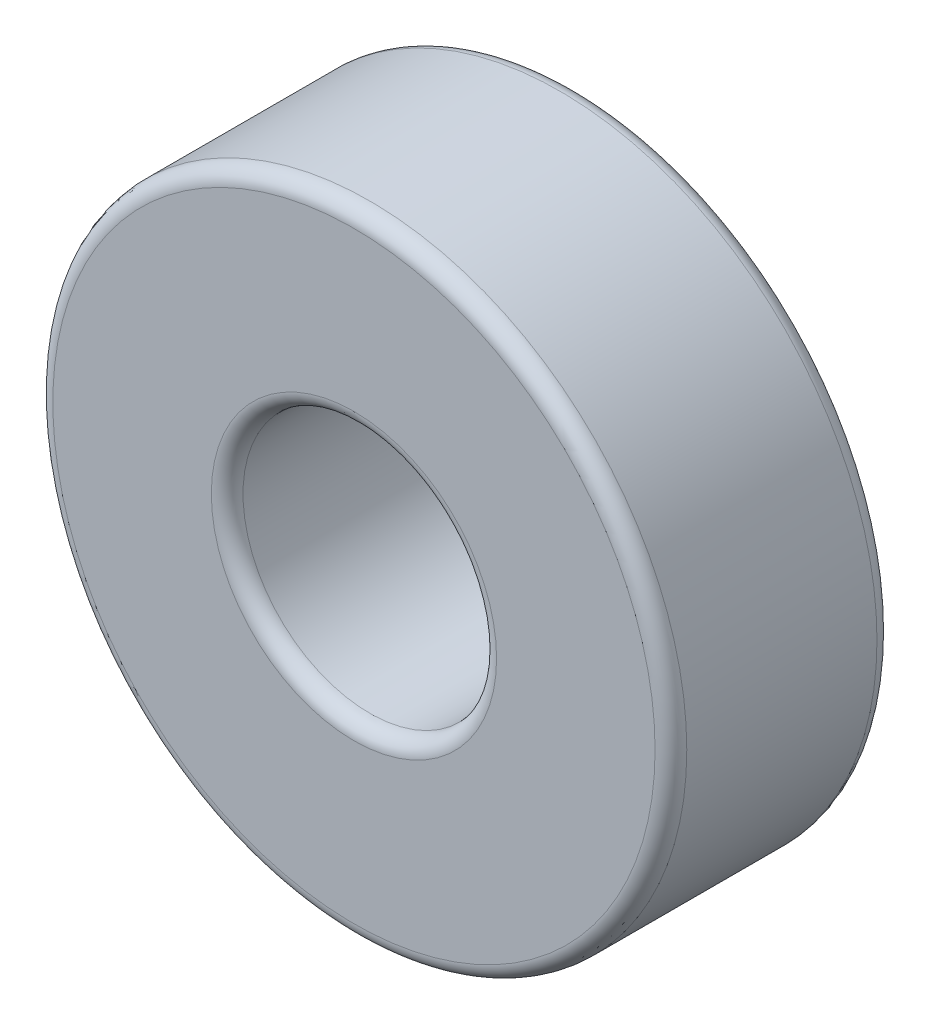
ISO-10303-21;
HEADER;
FILE_DESCRIPTION(('STEP AP214'),'2;1');
FILE_NAME('part.step','',(''),(''),'','','');
FILE_SCHEMA(('AUTOMOTIVE_DESIGN { 1 0 10303 214 1 1 1 1 }'));
ENDSEC;
DATA;
#1=APPLICATION_CONTEXT('core data for automotive mechanical design processes');
#2=APPLICATION_PROTOCOL_DEFINITION('international standard','automotive_design',2000,#1);
#3=PRODUCT_CONTEXT('',#1,'mechanical');
#4=PRODUCT('Part','Part','',(#3));
#5=PRODUCT_RELATED_PRODUCT_CATEGORY('part','',(#4));
#6=PRODUCT_DEFINITION_FORMATION('','',#4);
#7=PRODUCT_DEFINITION_CONTEXT('part definition',#1,'design');
#8=PRODUCT_DEFINITION('design','',#6,#7);
#9=PRODUCT_DEFINITION_SHAPE('','',#8);
#10=(LENGTH_UNIT() NAMED_UNIT(*) SI_UNIT(.MILLI.,.METRE.));
#11=(NAMED_UNIT(*) PLANE_ANGLE_UNIT() SI_UNIT($,.RADIAN.));
#12=(NAMED_UNIT(*) SI_UNIT($,.STERADIAN.) SOLID_ANGLE_UNIT());
#13=UNCERTAINTY_MEASURE_WITH_UNIT(LENGTH_MEASURE(1.E-05),#10,'distance_accuracy_value','');
#14=(GEOMETRIC_REPRESENTATION_CONTEXT(3) GLOBAL_UNCERTAINTY_ASSIGNED_CONTEXT((#13)) GLOBAL_UNIT_ASSIGNED_CONTEXT((#10,
#11,#12)) REPRESENTATION_CONTEXT('',''));
#15=CARTESIAN_POINT('',(0.,0.,0.));
#16=DIRECTION('',(0.,0.,1.));
#17=DIRECTION('',(1.,0.,0.));
#18=AXIS2_PLACEMENT_3D('',#15,#16,#17);
#19=CARTESIAN_POINT('',(0.,0.,7.));
#20=DIRECTION('',(0.,0.,1.));
#21=DIRECTION('',(1.,0.,0.));
#22=AXIS2_PLACEMENT_3D('',#19,#20,#21);
#23=PLANE('',#22);
#24=CARTESIAN_POINT('',(0.,0.,7.));
#25=DIRECTION('',(0.,0.,1.));
#26=DIRECTION('',(1.,0.,0.));
#27=AXIS2_PLACEMENT_3D('',#24,#25,#26);
#28=CIRCLE('',#27,4.5);
#29=CARTESIAN_POINT('',(4.5,0.,7.));
#30=VERTEX_POINT('',#29);
#31=EDGE_CURVE('E50',#30,#30,#28,.F.);
#32=ORIENTED_EDGE('',*,*,#31,.T.);
#33=EDGE_LOOP('',(#32));
#34=FACE_BOUND('',#33,.T.);
#35=CARTESIAN_POINT('',(0.,0.,7.));
#36=DIRECTION('',(0.,0.,1.));
#37=DIRECTION('',(1.,0.,0.));
#38=AXIS2_PLACEMENT_3D('',#35,#36,#37);
#39=CIRCLE('',#38,9.5);
#40=CARTESIAN_POINT('',(9.5,0.,7.));
#41=VERTEX_POINT('',#40);
#42=EDGE_CURVE('E55',#41,#41,#39,.T.);
#43=ORIENTED_EDGE('',*,*,#42,.T.);
#44=EDGE_LOOP('',(#43));
#45=FACE_BOUND('',#44,.T.);
#46=ADVANCED_FACE('F37',(#34,#45),#23,.T.);
#47=CARTESIAN_POINT('',(0.,0.,0.));
#48=DIRECTION('',(0.,0.,1.));
#49=DIRECTION('',(1.,0.,0.));
#50=AXIS2_PLACEMENT_3D('',#47,#48,#49);
#51=PLANE('',#50);
#52=CARTESIAN_POINT('',(0.,0.,0.));
#53=DIRECTION('',(0.,0.,1.));
#54=DIRECTION('',(1.,0.,0.));
#55=AXIS2_PLACEMENT_3D('',#52,#53,#54);
#56=CIRCLE('',#55,4.5);
#57=CARTESIAN_POINT('',(4.5,0.,0.));
#58=VERTEX_POINT('',#57);
#59=EDGE_CURVE('E69',#58,#58,#56,.T.);
#60=ORIENTED_EDGE('',*,*,#59,.T.);
#61=EDGE_LOOP('',(#60));
#62=FACE_BOUND('',#61,.T.);
#63=CARTESIAN_POINT('',(0.,0.,0.));
#64=DIRECTION('',(0.,0.,1.));
#65=DIRECTION('',(1.,0.,0.));
#66=AXIS2_PLACEMENT_3D('',#63,#64,#65);
#67=CIRCLE('',#66,9.5);
#68=CARTESIAN_POINT('',(9.5,0.,0.));
#69=VERTEX_POINT('',#68);
#70=EDGE_CURVE('E73',#69,#69,#67,.F.);
#71=ORIENTED_EDGE('',*,*,#70,.T.);
#72=EDGE_LOOP('',(#71));
#73=FACE_BOUND('',#72,.T.);
#74=ADVANCED_FACE('F78',(#62,#73),#51,.F.);
#75=CARTESIAN_POINT('',(0.,0.,7.));
#76=DIRECTION('',(0.,0.,-1.));
#77=DIRECTION('',(-1.,0.,0.));
#78=AXIS2_PLACEMENT_3D('',#75,#76,#77);
#79=CYLINDRICAL_SURFACE('',#78,10.);
#80=CARTESIAN_POINT('',(0.,0.,0.5));
#81=DIRECTION('',(0.,0.,1.));
#82=DIRECTION('',(1.,0.,0.));
#83=AXIS2_PLACEMENT_3D('',#80,#81,#82);
#84=CIRCLE('',#83,10.);
#85=CARTESIAN_POINT('',(10.,0.,0.5));
#86=VERTEX_POINT('',#85);
#87=EDGE_CURVE('E10',#86,#86,#84,.T.);
#88=ORIENTED_EDGE('',*,*,#87,.T.);
#89=EDGE_LOOP('',(#88));
#90=FACE_BOUND('',#89,.T.);
#91=CARTESIAN_POINT('',(0.,0.,6.5));
#92=DIRECTION('',(0.,0.,1.));
#93=DIRECTION('',(1.,0.,0.));
#94=AXIS2_PLACEMENT_3D('',#91,#92,#93);
#95=CIRCLE('',#94,10.);
#96=CARTESIAN_POINT('',(10.,0.,6.5));
#97=VERTEX_POINT('',#96);
#98=EDGE_CURVE('E45',#97,#97,#95,.F.);
#99=ORIENTED_EDGE('',*,*,#98,.T.);
#100=EDGE_LOOP('',(#99));
#101=FACE_BOUND('',#100,.T.);
#102=ADVANCED_FACE('F98',(#90,#101),#79,.T.);
#103=CARTESIAN_POINT('',(0.,0.,7.));
#104=DIRECTION('',(0.,0.,-1.));
#105=DIRECTION('',(-1.,0.,0.));
#106=AXIS2_PLACEMENT_3D('',#103,#104,#105);
#107=CYLINDRICAL_SURFACE('',#106,4.);
#108=CARTESIAN_POINT('',(0.,0.,0.5));
#109=DIRECTION('',(0.,0.,1.));
#110=DIRECTION('',(1.,0.,0.));
#111=AXIS2_PLACEMENT_3D('',#108,#109,#110);
#112=CIRCLE('',#111,4.);
#113=CARTESIAN_POINT('',(4.,0.,0.5));
#114=VERTEX_POINT('',#113);
#115=EDGE_CURVE('E61',#114,#114,#112,.F.);
#116=ORIENTED_EDGE('',*,*,#115,.T.);
#117=EDGE_LOOP('',(#116));
#118=FACE_BOUND('',#117,.T.);
#119=CARTESIAN_POINT('',(0.,0.,6.5));
#120=DIRECTION('',(0.,0.,1.));
#121=DIRECTION('',(1.,0.,0.));
#122=AXIS2_PLACEMENT_3D('',#119,#120,#121);
#123=CIRCLE('',#122,4.);
#124=CARTESIAN_POINT('',(4.,0.,6.5));
#125=VERTEX_POINT('',#124);
#126=EDGE_CURVE('E65',#125,#125,#123,.T.);
#127=ORIENTED_EDGE('',*,*,#126,.T.);
#128=EDGE_LOOP('',(#127));
#129=FACE_BOUND('',#128,.T.);
#130=ADVANCED_FACE('F103',(#118,#129),#107,.F.);
#131=CARTESIAN_POINT('',(0.,0.,0.5));
#132=DIRECTION('',(0.,0.,1.));
#133=DIRECTION('',(1.,0.,0.));
#134=AXIS2_PLACEMENT_3D('',#131,#132,#133);
#135=TOROIDAL_SURFACE('',#134,4.5,0.5);
#136=ORIENTED_EDGE('',*,*,#115,.F.);
#137=EDGE_LOOP('',(#136));
#138=FACE_BOUND('',#137,.T.);
#139=ORIENTED_EDGE('',*,*,#59,.F.);
#140=EDGE_LOOP('',(#139));
#141=FACE_BOUND('',#140,.T.);
#142=ADVANCED_FACE('F89',(#138,#141),#135,.T.);
#143=CARTESIAN_POINT('',(0.,0.,6.5));
#144=DIRECTION('',(0.,0.,1.));
#145=DIRECTION('',(1.,0.,0.));
#146=AXIS2_PLACEMENT_3D('',#143,#144,#145);
#147=TOROIDAL_SURFACE('',#146,4.5,0.5);
#148=ORIENTED_EDGE('',*,*,#31,.F.);
#149=EDGE_LOOP('',(#148));
#150=FACE_BOUND('',#149,.T.);
#151=ORIENTED_EDGE('',*,*,#126,.F.);
#152=EDGE_LOOP('',(#151));
#153=FACE_BOUND('',#152,.T.);
#154=ADVANCED_FACE('F83',(#150,#153),#147,.T.);
#155=CARTESIAN_POINT('',(0.,0.,0.5));
#156=DIRECTION('',(0.,0.,1.));
#157=DIRECTION('',(1.,0.,0.));
#158=AXIS2_PLACEMENT_3D('',#155,#156,#157);
#159=TOROIDAL_SURFACE('',#158,9.5,0.5);
#160=ORIENTED_EDGE('',*,*,#70,.F.);
#161=EDGE_LOOP('',(#160));
#162=FACE_BOUND('',#161,.T.);
#163=ORIENTED_EDGE('',*,*,#87,.F.);
#164=EDGE_LOOP('',(#163));
#165=FACE_BOUND('',#164,.T.);
#166=ADVANCED_FACE('F80',(#162,#165),#159,.T.);
#167=CARTESIAN_POINT('',(0.,0.,6.5));
#168=DIRECTION('',(0.,0.,1.));
#169=DIRECTION('',(1.,0.,0.));
#170=AXIS2_PLACEMENT_3D('',#167,#168,#169);
#171=TOROIDAL_SURFACE('',#170,9.5,0.5);
#172=ORIENTED_EDGE('',*,*,#98,.F.);
#173=EDGE_LOOP('',(#172));
#174=FACE_BOUND('',#173,.T.);
#175=ORIENTED_EDGE('',*,*,#42,.F.);
#176=EDGE_LOOP('',(#175));
#177=FACE_BOUND('',#176,.T.);
#178=ADVANCED_FACE('F39',(#174,#177),#171,.T.);
#179=CLOSED_SHELL('',(#46,#74,#102,#130,#142,#154,#166,#178));
#180=MANIFOLD_SOLID_BREP('B2',#179);
#181=ADVANCED_BREP_SHAPE_REPRESENTATION('',(#18,#180),#14);
#182=SHAPE_DEFINITION_REPRESENTATION(#9,#181);
ENDSEC;
END-ISO-10303-21;
